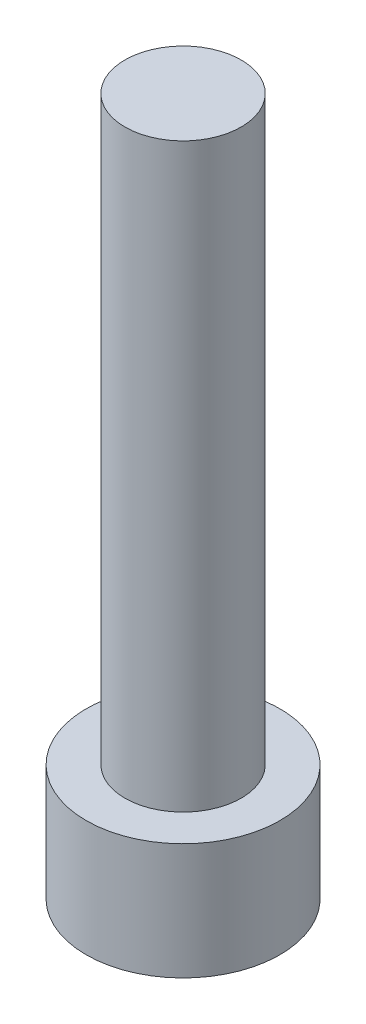
ISO-10303-21;
HEADER;
FILE_DESCRIPTION(('STEP AP214'),'2;1');
FILE_NAME('part.step','',(''),(''),'','','');
FILE_SCHEMA(('AUTOMOTIVE_DESIGN { 1 0 10303 214 1 1 1 1 }'));
ENDSEC;
DATA;
#1=APPLICATION_CONTEXT('core data for automotive mechanical design processes');
#2=APPLICATION_PROTOCOL_DEFINITION('international standard','automotive_design',2000,#1);
#3=PRODUCT_CONTEXT('',#1,'mechanical');
#4=PRODUCT('Part','Part','',(#3));
#5=PRODUCT_RELATED_PRODUCT_CATEGORY('part','',(#4));
#6=PRODUCT_DEFINITION_FORMATION('','',#4);
#7=PRODUCT_DEFINITION_CONTEXT('part definition',#1,'design');
#8=PRODUCT_DEFINITION('design','',#6,#7);
#9=PRODUCT_DEFINITION_SHAPE('','',#8);
#10=(LENGTH_UNIT() NAMED_UNIT(*) SI_UNIT(.MILLI.,.METRE.));
#11=(NAMED_UNIT(*) PLANE_ANGLE_UNIT() SI_UNIT($,.RADIAN.));
#12=(NAMED_UNIT(*) SI_UNIT($,.STERADIAN.) SOLID_ANGLE_UNIT());
#13=UNCERTAINTY_MEASURE_WITH_UNIT(LENGTH_MEASURE(1.E-05),#10,'distance_accuracy_value','');
#14=(GEOMETRIC_REPRESENTATION_CONTEXT(3) GLOBAL_UNCERTAINTY_ASSIGNED_CONTEXT((#13)) GLOBAL_UNIT_ASSIGNED_CONTEXT((#10,
#11,#12)) REPRESENTATION_CONTEXT('',''));
#15=CARTESIAN_POINT('',(0.,0.,0.));
#16=DIRECTION('',(0.,0.,1.));
#17=DIRECTION('',(1.,0.,0.));
#18=AXIS2_PLACEMENT_3D('',#15,#16,#17);
#19=CARTESIAN_POINT('',(0.,0.,0.));
#20=DIRECTION('',(0.,1.,0.));
#21=DIRECTION('',(0.,0.,1.));
#22=AXIS2_PLACEMENT_3D('',#19,#20,#21);
#23=PLANE('',#22);
#24=CARTESIAN_POINT('',(0.,0.,0.));
#25=DIRECTION('',(0.,1.,0.));
#26=DIRECTION('',(0.,0.,1.));
#27=AXIS2_PLACEMENT_3D('',#24,#25,#26);
#28=CIRCLE('',#27,5.);
#29=CARTESIAN_POINT('',(0.,0.,5.));
#30=VERTEX_POINT('',#29);
#31=EDGE_CURVE('E39',#30,#30,#28,.T.);
#32=ORIENTED_EDGE('',*,*,#31,.F.);
#33=EDGE_LOOP('',(#32));
#34=FACE_BOUND('',#33,.T.);
#35=DIRECTION('',(0.5,0.,-0.866025403784439));
#36=VECTOR('',#35,1.);
#37=CARTESIAN_POINT('',(1.44337567297407,0.,2.5));
#38=LINE('',#37,#36);
#39=CARTESIAN_POINT('',(1.44337567297407,0.,2.5));
#40=VERTEX_POINT('',#39);
#41=CARTESIAN_POINT('',(2.88675134594813,0.,0.));
#42=VERTEX_POINT('',#41);
#43=EDGE_CURVE('E52',#40,#42,#38,.T.);
#44=ORIENTED_EDGE('',*,*,#43,.T.);
#45=DIRECTION('',(-0.5,0.,-0.866025403784438));
#46=VECTOR('',#45,1.);
#47=CARTESIAN_POINT('',(2.88675134594813,0.,0.));
#48=LINE('',#47,#46);
#49=CARTESIAN_POINT('',(1.44337567297406,0.,-2.5));
#50=VERTEX_POINT('',#49);
#51=EDGE_CURVE('E123',#42,#50,#48,.T.);
#52=ORIENTED_EDGE('',*,*,#51,.T.);
#53=DIRECTION('',(-1.,0.,0.));
#54=VECTOR('',#53,1.);
#55=CARTESIAN_POINT('',(1.44337567297406,0.,-2.5));
#56=LINE('',#55,#54);
#57=CARTESIAN_POINT('',(-1.44337567297406,0.,-2.5));
#58=VERTEX_POINT('',#57);
#59=EDGE_CURVE('E126',#50,#58,#56,.T.);
#60=ORIENTED_EDGE('',*,*,#59,.T.);
#61=DIRECTION('',(-0.5,0.,0.866025403784439));
#62=VECTOR('',#61,1.);
#63=CARTESIAN_POINT('',(-1.44337567297406,0.,-2.5));
#64=LINE('',#63,#62);
#65=CARTESIAN_POINT('',(-2.88675134594813,0.,0.));
#66=VERTEX_POINT('',#65);
#67=EDGE_CURVE('E129',#58,#66,#64,.T.);
#68=ORIENTED_EDGE('',*,*,#67,.T.);
#69=DIRECTION('',(0.5,0.,0.866025403784438));
#70=VECTOR('',#69,1.);
#71=CARTESIAN_POINT('',(-2.88675134594813,0.,0.));
#72=LINE('',#71,#70);
#73=CARTESIAN_POINT('',(-1.44337567297406,0.,2.5));
#74=VERTEX_POINT('',#73);
#75=EDGE_CURVE('E113',#66,#74,#72,.T.);
#76=ORIENTED_EDGE('',*,*,#75,.T.);
#77=DIRECTION('',(1.,0.,0.));
#78=VECTOR('',#77,1.);
#79=CARTESIAN_POINT('',(-1.44337567297406,0.,2.5));
#80=LINE('',#79,#78);
#81=EDGE_CURVE('E132',#74,#40,#80,.T.);
#82=ORIENTED_EDGE('',*,*,#81,.T.);
#83=EDGE_LOOP('',(#44,#52,#60,#68,#76,#82));
#84=FACE_BOUND('',#83,.T.);
#85=ADVANCED_FACE('F35',(#34,#84),#23,.F.);
#86=CARTESIAN_POINT('',(0.,6.,0.));
#87=DIRECTION('',(0.,-1.,0.));
#88=DIRECTION('',(0.,0.,-1.));
#89=AXIS2_PLACEMENT_3D('',#86,#87,#88);
#90=CYLINDRICAL_SURFACE('',#89,5.);
#91=CARTESIAN_POINT('',(0.,6.,0.));
#92=DIRECTION('',(0.,1.,0.));
#93=DIRECTION('',(0.,0.,1.));
#94=AXIS2_PLACEMENT_3D('',#91,#92,#93);
#95=CIRCLE('',#94,5.);
#96=CARTESIAN_POINT('',(0.,6.,5.));
#97=VERTEX_POINT('',#96);
#98=EDGE_CURVE('E44',#97,#97,#95,.T.);
#99=ORIENTED_EDGE('',*,*,#98,.F.);
#100=EDGE_LOOP('',(#99));
#101=FACE_BOUND('',#100,.T.);
#102=ORIENTED_EDGE('',*,*,#31,.T.);
#103=EDGE_LOOP('',(#102));
#104=FACE_BOUND('',#103,.T.);
#105=ADVANCED_FACE('F37',(#101,#104),#90,.T.);
#106=CARTESIAN_POINT('',(0.,6.,0.));
#107=DIRECTION('',(0.,1.,0.));
#108=DIRECTION('',(0.,0.,1.));
#109=AXIS2_PLACEMENT_3D('',#106,#107,#108);
#110=PLANE('',#109);
#111=CARTESIAN_POINT('',(0.,6.,0.));
#112=DIRECTION('',(0.,1.,0.));
#113=DIRECTION('',(0.,0.,1.));
#114=AXIS2_PLACEMENT_3D('',#111,#112,#113);
#115=CIRCLE('',#114,3.);
#116=CARTESIAN_POINT('',(0.,6.,3.));
#117=VERTEX_POINT('',#116);
#118=EDGE_CURVE('E11',#117,#117,#115,.T.);
#119=ORIENTED_EDGE('',*,*,#118,.F.);
#120=EDGE_LOOP('',(#119));
#121=FACE_BOUND('',#120,.T.);
#122=ORIENTED_EDGE('',*,*,#98,.T.);
#123=EDGE_LOOP('',(#122));
#124=FACE_BOUND('',#123,.T.);
#125=ADVANCED_FACE('F182',(#121,#124),#110,.T.);
#126=CARTESIAN_POINT('',(0.,36.,0.));
#127=DIRECTION('',(0.,-1.,0.));
#128=DIRECTION('',(0.,0.,-1.));
#129=AXIS2_PLACEMENT_3D('',#126,#127,#128);
#130=CYLINDRICAL_SURFACE('',#129,3.);
#131=CARTESIAN_POINT('',(0.,36.,0.));
#132=DIRECTION('',(0.,1.,0.));
#133=DIRECTION('',(0.,0.,1.));
#134=AXIS2_PLACEMENT_3D('',#131,#132,#133);
#135=CIRCLE('',#134,3.);
#136=CARTESIAN_POINT('',(0.,36.,3.));
#137=VERTEX_POINT('',#136);
#138=EDGE_CURVE('E143',#137,#137,#135,.T.);
#139=ORIENTED_EDGE('',*,*,#138,.F.);
#140=EDGE_LOOP('',(#139));
#141=FACE_BOUND('',#140,.T.);
#142=ORIENTED_EDGE('',*,*,#118,.T.);
#143=EDGE_LOOP('',(#142));
#144=FACE_BOUND('',#143,.T.);
#145=ADVANCED_FACE('F178',(#141,#144),#130,.T.);
#146=CARTESIAN_POINT('',(0.,36.,0.));
#147=DIRECTION('',(0.,1.,0.));
#148=DIRECTION('',(0.,0.,1.));
#149=AXIS2_PLACEMENT_3D('',#146,#147,#148);
#150=PLANE('',#149);
#151=ORIENTED_EDGE('',*,*,#138,.T.);
#152=EDGE_LOOP('',(#151));
#153=FACE_BOUND('',#152,.T.);
#154=ADVANCED_FACE('F172',(#153),#150,.T.);
#155=CARTESIAN_POINT('',(1.44337567297407,3.,2.5));
#156=DIRECTION('',(-0.866025403784439,0.,-0.5));
#157=DIRECTION('',(-0.5,0.,0.866025403784439));
#158=AXIS2_PLACEMENT_3D('',#155,#156,#157);
#159=PLANE('',#158);
#160=ORIENTED_EDGE('',*,*,#43,.F.);
#161=DIRECTION('',(0.,-1.,0.));
#162=VECTOR('',#161,1.);
#163=CARTESIAN_POINT('',(1.44337567297407,3.,2.5));
#164=LINE('',#163,#162);
#165=CARTESIAN_POINT('',(1.44337567297407,3.,2.5));
#166=VERTEX_POINT('',#165);
#167=EDGE_CURVE('E118',#166,#40,#164,.T.);
#168=ORIENTED_EDGE('',*,*,#167,.F.);
#169=DIRECTION('',(0.5,0.,-0.866025403784439));
#170=VECTOR('',#169,1.);
#171=CARTESIAN_POINT('',(1.44337567297407,3.,2.5));
#172=LINE('',#171,#170);
#173=CARTESIAN_POINT('',(2.88675134594813,3.,0.));
#174=VERTEX_POINT('',#173);
#175=EDGE_CURVE('E135',#166,#174,#172,.T.);
#176=ORIENTED_EDGE('',*,*,#175,.T.);
#177=DIRECTION('',(0.,-1.,0.));
#178=VECTOR('',#177,1.);
#179=CARTESIAN_POINT('',(2.88675134594813,3.,0.));
#180=LINE('',#179,#178);
#181=EDGE_CURVE('E141',#174,#42,#180,.T.);
#182=ORIENTED_EDGE('',*,*,#181,.T.);
#183=EDGE_LOOP('',(#160,#168,#176,#182));
#184=FACE_BOUND('',#183,.T.);
#185=ADVANCED_FACE('F155',(#184),#159,.T.);
#186=CARTESIAN_POINT('',(2.88675134594813,3.,0.));
#187=DIRECTION('',(-0.866025403784438,0.,0.5));
#188=DIRECTION('',(0.5,0.,0.866025403784438));
#189=AXIS2_PLACEMENT_3D('',#186,#187,#188);
#190=PLANE('',#189);
#191=ORIENTED_EDGE('',*,*,#51,.F.);
#192=ORIENTED_EDGE('',*,*,#181,.F.);
#193=DIRECTION('',(-0.5,0.,-0.866025403784438));
#194=VECTOR('',#193,1.);
#195=CARTESIAN_POINT('',(2.88675134594813,3.,0.));
#196=LINE('',#195,#194);
#197=CARTESIAN_POINT('',(1.44337567297406,3.,-2.5));
#198=VERTEX_POINT('',#197);
#199=EDGE_CURVE('E91',#174,#198,#196,.T.);
#200=ORIENTED_EDGE('',*,*,#199,.T.);
#201=DIRECTION('',(0.,-1.,0.));
#202=VECTOR('',#201,1.);
#203=CARTESIAN_POINT('',(1.44337567297406,3.,-2.5));
#204=LINE('',#203,#202);
#205=EDGE_CURVE('E139',#198,#50,#204,.T.);
#206=ORIENTED_EDGE('',*,*,#205,.T.);
#207=EDGE_LOOP('',(#191,#192,#200,#206));
#208=FACE_BOUND('',#207,.T.);
#209=ADVANCED_FACE('F164',(#208),#190,.T.);
#210=CARTESIAN_POINT('',(1.44337567297406,3.,-2.5));
#211=DIRECTION('',(0.,0.,1.));
#212=DIRECTION('',(1.,0.,0.));
#213=AXIS2_PLACEMENT_3D('',#210,#211,#212);
#214=PLANE('',#213);
#215=ORIENTED_EDGE('',*,*,#59,.F.);
#216=ORIENTED_EDGE('',*,*,#205,.F.);
#217=DIRECTION('',(-1.,0.,0.));
#218=VECTOR('',#217,1.);
#219=CARTESIAN_POINT('',(1.44337567297406,3.,-2.5));
#220=LINE('',#219,#218);
#221=CARTESIAN_POINT('',(-1.44337567297406,3.,-2.5));
#222=VERTEX_POINT('',#221);
#223=EDGE_CURVE('E109',#198,#222,#220,.T.);
#224=ORIENTED_EDGE('',*,*,#223,.T.);
#225=DIRECTION('',(0.,-1.,0.));
#226=VECTOR('',#225,1.);
#227=CARTESIAN_POINT('',(-1.44337567297406,3.,-2.5));
#228=LINE('',#227,#226);
#229=EDGE_CURVE('E106',#222,#58,#228,.T.);
#230=ORIENTED_EDGE('',*,*,#229,.T.);
#231=EDGE_LOOP('',(#215,#216,#224,#230));
#232=FACE_BOUND('',#231,.T.);
#233=ADVANCED_FACE('F162',(#232),#214,.T.);
#234=CARTESIAN_POINT('',(-1.44337567297406,3.,-2.5));
#235=DIRECTION('',(0.866025403784438,0.,0.5));
#236=DIRECTION('',(0.5,0.,-0.866025403784439));
#237=AXIS2_PLACEMENT_3D('',#234,#235,#236);
#238=PLANE('',#237);
#239=ORIENTED_EDGE('',*,*,#67,.F.);
#240=ORIENTED_EDGE('',*,*,#229,.F.);
#241=DIRECTION('',(-0.5,0.,0.866025403784439));
#242=VECTOR('',#241,1.);
#243=CARTESIAN_POINT('',(-1.44337567297406,3.,-2.5));
#244=LINE('',#243,#242);
#245=CARTESIAN_POINT('',(-2.88675134594813,3.,0.));
#246=VERTEX_POINT('',#245);
#247=EDGE_CURVE('E101',#222,#246,#244,.T.);
#248=ORIENTED_EDGE('',*,*,#247,.T.);
#249=DIRECTION('',(0.,-1.,0.));
#250=VECTOR('',#249,1.);
#251=CARTESIAN_POINT('',(-2.88675134594813,3.,0.));
#252=LINE('',#251,#250);
#253=EDGE_CURVE('E105',#246,#66,#252,.T.);
#254=ORIENTED_EDGE('',*,*,#253,.T.);
#255=EDGE_LOOP('',(#239,#240,#248,#254));
#256=FACE_BOUND('',#255,.T.);
#257=ADVANCED_FACE('F104',(#256),#238,.T.);
#258=CARTESIAN_POINT('',(-2.88675134594813,3.,0.));
#259=DIRECTION('',(0.866025403784439,0.,-0.5));
#260=DIRECTION('',(-0.5,0.,-0.866025403784439));
#261=AXIS2_PLACEMENT_3D('',#258,#259,#260);
#262=PLANE('',#261);
#263=ORIENTED_EDGE('',*,*,#75,.F.);
#264=ORIENTED_EDGE('',*,*,#253,.F.);
#265=DIRECTION('',(0.5,0.,0.866025403784438));
#266=VECTOR('',#265,1.);
#267=CARTESIAN_POINT('',(-2.88675134594813,3.,0.));
#268=LINE('',#267,#266);
#269=CARTESIAN_POINT('',(-1.44337567297406,3.,2.5));
#270=VERTEX_POINT('',#269);
#271=EDGE_CURVE('E108',#246,#270,#268,.T.);
#272=ORIENTED_EDGE('',*,*,#271,.T.);
#273=DIRECTION('',(0.,-1.,0.));
#274=VECTOR('',#273,1.);
#275=CARTESIAN_POINT('',(-1.44337567297406,3.,2.5));
#276=LINE('',#275,#274);
#277=EDGE_CURVE('E82',#270,#74,#276,.T.);
#278=ORIENTED_EDGE('',*,*,#277,.T.);
#279=EDGE_LOOP('',(#263,#264,#272,#278));
#280=FACE_BOUND('',#279,.T.);
#281=ADVANCED_FACE('F111',(#280),#262,.T.);
#282=CARTESIAN_POINT('',(-1.44337567297406,3.,2.5));
#283=DIRECTION('',(0.,0.,-1.));
#284=DIRECTION('',(-1.,0.,0.));
#285=AXIS2_PLACEMENT_3D('',#282,#283,#284);
#286=PLANE('',#285);
#287=ORIENTED_EDGE('',*,*,#81,.F.);
#288=ORIENTED_EDGE('',*,*,#277,.F.);
#289=DIRECTION('',(1.,0.,0.));
#290=VECTOR('',#289,1.);
#291=CARTESIAN_POINT('',(-1.44337567297406,3.,2.5));
#292=LINE('',#291,#290);
#293=EDGE_CURVE('E60',#270,#166,#292,.T.);
#294=ORIENTED_EDGE('',*,*,#293,.T.);
#295=ORIENTED_EDGE('',*,*,#167,.T.);
#296=EDGE_LOOP('',(#287,#288,#294,#295));
#297=FACE_BOUND('',#296,.T.);
#298=ADVANCED_FACE('F154',(#297),#286,.T.);
#299=CARTESIAN_POINT('',(0.,3.,0.));
#300=DIRECTION('',(0.,1.,0.));
#301=DIRECTION('',(0.,0.,1.));
#302=AXIS2_PLACEMENT_3D('',#299,#300,#301);
#303=PLANE('',#302);
#304=ORIENTED_EDGE('',*,*,#175,.F.);
#305=ORIENTED_EDGE('',*,*,#293,.F.);
#306=ORIENTED_EDGE('',*,*,#271,.F.);
#307=ORIENTED_EDGE('',*,*,#247,.F.);
#308=ORIENTED_EDGE('',*,*,#223,.F.);
#309=ORIENTED_EDGE('',*,*,#199,.F.);
#310=EDGE_LOOP('',(#304,#305,#306,#307,#308,#309));
#311=FACE_BOUND('',#310,.T.);
#312=ADVANCED_FACE('F116',(#311),#303,.F.);
#313=CLOSED_SHELL('',(#85,#105,#125,#145,#154,#185,#209,#233,#257,#281,#298,#312));
#314=MANIFOLD_SOLID_BREP('B2',#313);
#315=ADVANCED_BREP_SHAPE_REPRESENTATION('',(#18,#314),#14);
#316=SHAPE_DEFINITION_REPRESENTATION(#9,#315);
ENDSEC;
END-ISO-10303-21;
